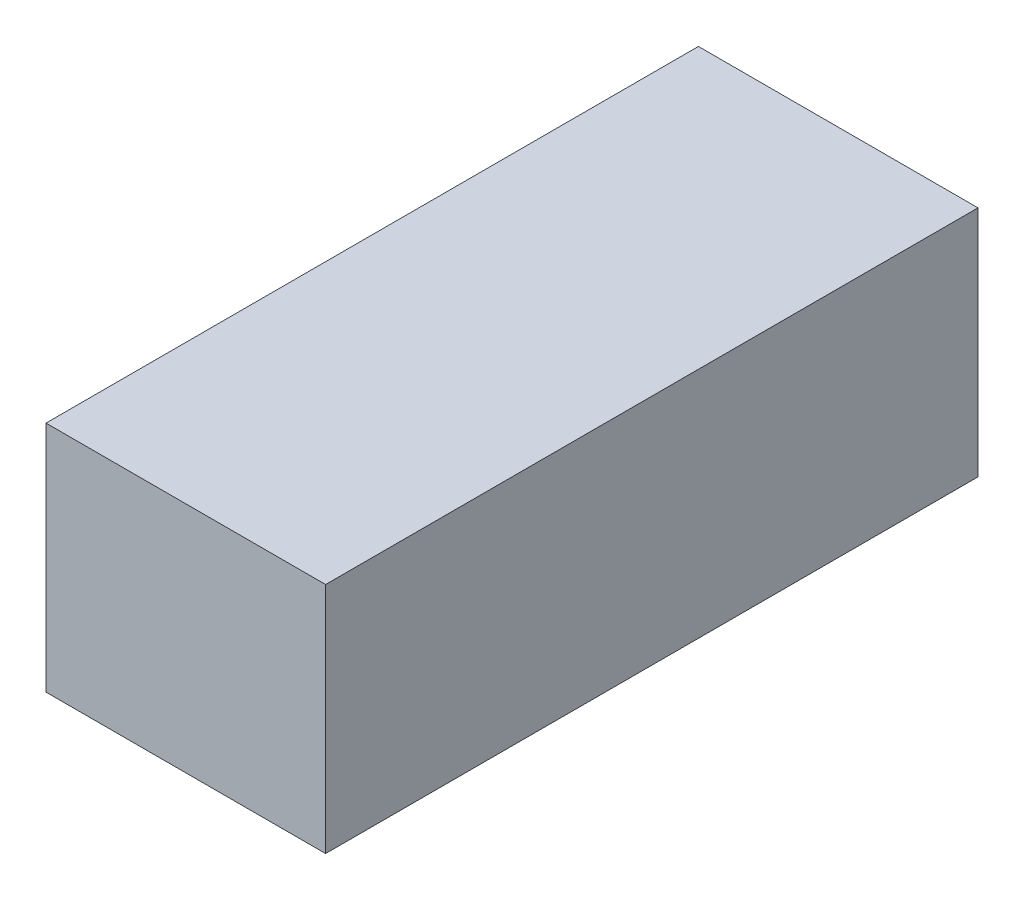
ISO-10303-21;
HEADER;
FILE_DESCRIPTION(('STEP AP214'),'2;1');
FILE_NAME('part.step','',(''),(''),'','','');
FILE_SCHEMA(('AUTOMOTIVE_DESIGN { 1 0 10303 214 1 1 1 1 }'));
ENDSEC;
DATA;
#1=APPLICATION_CONTEXT('core data for automotive mechanical design processes');
#2=APPLICATION_PROTOCOL_DEFINITION('international standard','automotive_design',2000,#1);
#3=PRODUCT_CONTEXT('',#1,'mechanical');
#4=PRODUCT('Part','Part','',(#3));
#5=PRODUCT_RELATED_PRODUCT_CATEGORY('part','',(#4));
#6=PRODUCT_DEFINITION_FORMATION('','',#4);
#7=PRODUCT_DEFINITION_CONTEXT('part definition',#1,'design');
#8=PRODUCT_DEFINITION('design','',#6,#7);
#9=PRODUCT_DEFINITION_SHAPE('','',#8);
#10=(LENGTH_UNIT() NAMED_UNIT(*) SI_UNIT(.MILLI.,.METRE.));
#11=(NAMED_UNIT(*) PLANE_ANGLE_UNIT() SI_UNIT($,.RADIAN.));
#12=(NAMED_UNIT(*) SI_UNIT($,.STERADIAN.) SOLID_ANGLE_UNIT());
#13=UNCERTAINTY_MEASURE_WITH_UNIT(LENGTH_MEASURE(1.E-05),#10,'distance_accuracy_value','');
#14=(GEOMETRIC_REPRESENTATION_CONTEXT(3) GLOBAL_UNCERTAINTY_ASSIGNED_CONTEXT((#13)) GLOBAL_UNIT_ASSIGNED_CONTEXT((#10,
#11,#12)) REPRESENTATION_CONTEXT('',''));
#15=CARTESIAN_POINT('',(0.,0.,0.));
#16=DIRECTION('',(0.,0.,1.));
#17=DIRECTION('',(1.,0.,0.));
#18=AXIS2_PLACEMENT_3D('',#15,#16,#17);
#19=CARTESIAN_POINT('',(0.,0.,42.));
#20=DIRECTION('',(1.,0.,0.));
#21=DIRECTION('',(0.,1.,0.));
#22=AXIS2_PLACEMENT_3D('',#19,#20,#21);
#23=PLANE('',#22);
#24=DIRECTION('',(0.,-1.,0.));
#25=VECTOR('',#24,1.);
#26=CARTESIAN_POINT('',(0.,0.,0.));
#27=LINE('',#26,#25);
#28=CARTESIAN_POINT('',(0.,0.,0.));
#29=VERTEX_POINT('',#28);
#30=CARTESIAN_POINT('',(0.,-15.,0.));
#31=VERTEX_POINT('',#30);
#32=EDGE_CURVE('E98',#29,#31,#27,.T.);
#33=ORIENTED_EDGE('',*,*,#32,.T.);
#34=DIRECTION('',(0.,0.,-1.));
#35=VECTOR('',#34,1.);
#36=CARTESIAN_POINT('',(0.,-15.,42.));
#37=LINE('',#36,#35);
#38=CARTESIAN_POINT('',(0.,-15.,42.));
#39=VERTEX_POINT('',#38);
#40=EDGE_CURVE('E11',#39,#31,#37,.T.);
#41=ORIENTED_EDGE('',*,*,#40,.F.);
#42=DIRECTION('',(0.,-1.,0.));
#43=VECTOR('',#42,1.);
#44=CARTESIAN_POINT('',(0.,0.,42.));
#45=LINE('',#44,#43);
#46=CARTESIAN_POINT('',(0.,0.,42.));
#47=VERTEX_POINT('',#46);
#48=EDGE_CURVE('E86',#47,#39,#45,.T.);
#49=ORIENTED_EDGE('',*,*,#48,.F.);
#50=DIRECTION('',(0.,0.,-1.));
#51=VECTOR('',#50,1.);
#52=CARTESIAN_POINT('',(0.,0.,42.));
#53=LINE('',#52,#51);
#54=EDGE_CURVE('E94',#47,#29,#53,.T.);
#55=ORIENTED_EDGE('',*,*,#54,.T.);
#56=EDGE_LOOP('',(#33,#41,#49,#55));
#57=FACE_BOUND('',#56,.T.);
#58=ADVANCED_FACE('F35',(#57),#23,.F.);
#59=CARTESIAN_POINT('',(0.,-15.,42.));
#60=DIRECTION('',(0.,1.,0.));
#61=DIRECTION('',(0.,0.,1.));
#62=AXIS2_PLACEMENT_3D('',#59,#60,#61);
#63=PLANE('',#62);
#64=DIRECTION('',(1.,0.,0.));
#65=VECTOR('',#64,1.);
#66=CARTESIAN_POINT('',(0.,-15.,0.));
#67=LINE('',#66,#65);
#68=CARTESIAN_POINT('',(18.,-15.,0.));
#69=VERTEX_POINT('',#68);
#70=EDGE_CURVE('E90',#31,#69,#67,.T.);
#71=ORIENTED_EDGE('',*,*,#70,.T.);
#72=DIRECTION('',(0.,0.,-1.));
#73=VECTOR('',#72,1.);
#74=CARTESIAN_POINT('',(18.,-15.,42.));
#75=LINE('',#74,#73);
#76=CARTESIAN_POINT('',(18.,-15.,42.));
#77=VERTEX_POINT('',#76);
#78=EDGE_CURVE('E43',#77,#69,#75,.T.);
#79=ORIENTED_EDGE('',*,*,#78,.F.);
#80=DIRECTION('',(1.,0.,0.));
#81=VECTOR('',#80,1.);
#82=CARTESIAN_POINT('',(0.,-15.,42.));
#83=LINE('',#82,#81);
#84=EDGE_CURVE('E81',#39,#77,#83,.T.);
#85=ORIENTED_EDGE('',*,*,#84,.F.);
#86=ORIENTED_EDGE('',*,*,#40,.T.);
#87=EDGE_LOOP('',(#71,#79,#85,#86));
#88=FACE_BOUND('',#87,.T.);
#89=ADVANCED_FACE('F89',(#88),#63,.F.);
#90=CARTESIAN_POINT('',(18.,0.,42.));
#91=DIRECTION('',(-1.,0.,0.));
#92=DIRECTION('',(0.,-1.,0.));
#93=AXIS2_PLACEMENT_3D('',#90,#91,#92);
#94=PLANE('',#93);
#95=DIRECTION('',(0.,1.,0.));
#96=VECTOR('',#95,1.);
#97=CARTESIAN_POINT('',(18.,0.,0.));
#98=LINE('',#97,#96);
#99=CARTESIAN_POINT('',(18.,0.,0.));
#100=VERTEX_POINT('',#99);
#101=EDGE_CURVE('E68',#69,#100,#98,.T.);
#102=ORIENTED_EDGE('',*,*,#101,.T.);
#103=DIRECTION('',(0.,0.,-1.));
#104=VECTOR('',#103,1.);
#105=CARTESIAN_POINT('',(18.,0.,42.));
#106=LINE('',#105,#104);
#107=CARTESIAN_POINT('',(18.,0.,42.));
#108=VERTEX_POINT('',#107);
#109=EDGE_CURVE('E91',#108,#100,#106,.T.);
#110=ORIENTED_EDGE('',*,*,#109,.F.);
#111=DIRECTION('',(0.,1.,0.));
#112=VECTOR('',#111,1.);
#113=CARTESIAN_POINT('',(18.,0.,42.));
#114=LINE('',#113,#112);
#115=EDGE_CURVE('E84',#77,#108,#114,.T.);
#116=ORIENTED_EDGE('',*,*,#115,.F.);
#117=ORIENTED_EDGE('',*,*,#78,.T.);
#118=EDGE_LOOP('',(#102,#110,#116,#117));
#119=FACE_BOUND('',#118,.T.);
#120=ADVANCED_FACE('F92',(#119),#94,.F.);
#121=CARTESIAN_POINT('',(0.,0.,42.));
#122=DIRECTION('',(0.,-1.,0.));
#123=DIRECTION('',(0.,0.,-1.));
#124=AXIS2_PLACEMENT_3D('',#121,#122,#123);
#125=PLANE('',#124);
#126=DIRECTION('',(-1.,0.,0.));
#127=VECTOR('',#126,1.);
#128=CARTESIAN_POINT('',(0.,0.,0.));
#129=LINE('',#128,#127);
#130=EDGE_CURVE('E74',#100,#29,#129,.T.);
#131=ORIENTED_EDGE('',*,*,#130,.T.);
#132=ORIENTED_EDGE('',*,*,#54,.F.);
#133=DIRECTION('',(-1.,0.,0.));
#134=VECTOR('',#133,1.);
#135=CARTESIAN_POINT('',(0.,0.,42.));
#136=LINE('',#135,#134);
#137=EDGE_CURVE('E51',#108,#47,#136,.T.);
#138=ORIENTED_EDGE('',*,*,#137,.F.);
#139=ORIENTED_EDGE('',*,*,#109,.T.);
#140=EDGE_LOOP('',(#131,#132,#138,#139));
#141=FACE_BOUND('',#140,.T.);
#142=ADVANCED_FACE('F105',(#141),#125,.F.);
#143=CARTESIAN_POINT('',(0.,0.,42.));
#144=DIRECTION('',(0.,0.,1.));
#145=DIRECTION('',(1.,0.,0.));
#146=AXIS2_PLACEMENT_3D('',#143,#144,#145);
#147=PLANE('',#146);
#148=ORIENTED_EDGE('',*,*,#48,.T.);
#149=ORIENTED_EDGE('',*,*,#84,.T.);
#150=ORIENTED_EDGE('',*,*,#115,.T.);
#151=ORIENTED_EDGE('',*,*,#137,.T.);
#152=EDGE_LOOP('',(#148,#149,#150,#151));
#153=FACE_BOUND('',#152,.T.);
#154=ADVANCED_FACE('F82',(#153),#147,.T.);
#155=CARTESIAN_POINT('',(0.,0.,0.));
#156=DIRECTION('',(0.,0.,1.));
#157=DIRECTION('',(1.,0.,0.));
#158=AXIS2_PLACEMENT_3D('',#155,#156,#157);
#159=PLANE('',#158);
#160=ORIENTED_EDGE('',*,*,#32,.F.);
#161=ORIENTED_EDGE('',*,*,#130,.F.);
#162=ORIENTED_EDGE('',*,*,#101,.F.);
#163=ORIENTED_EDGE('',*,*,#70,.F.);
#164=EDGE_LOOP('',(#160,#161,#162,#163));
#165=FACE_BOUND('',#164,.T.);
#166=ADVANCED_FACE('F108',(#165),#159,.F.);
#167=CLOSED_SHELL('',(#58,#89,#120,#142,#154,#166));
#168=MANIFOLD_SOLID_BREP('B2',#167);
#169=ADVANCED_BREP_SHAPE_REPRESENTATION('',(#18,#168),#14);
#170=SHAPE_DEFINITION_REPRESENTATION(#9,#169);
ENDSEC;
END-ISO-10303-21;
